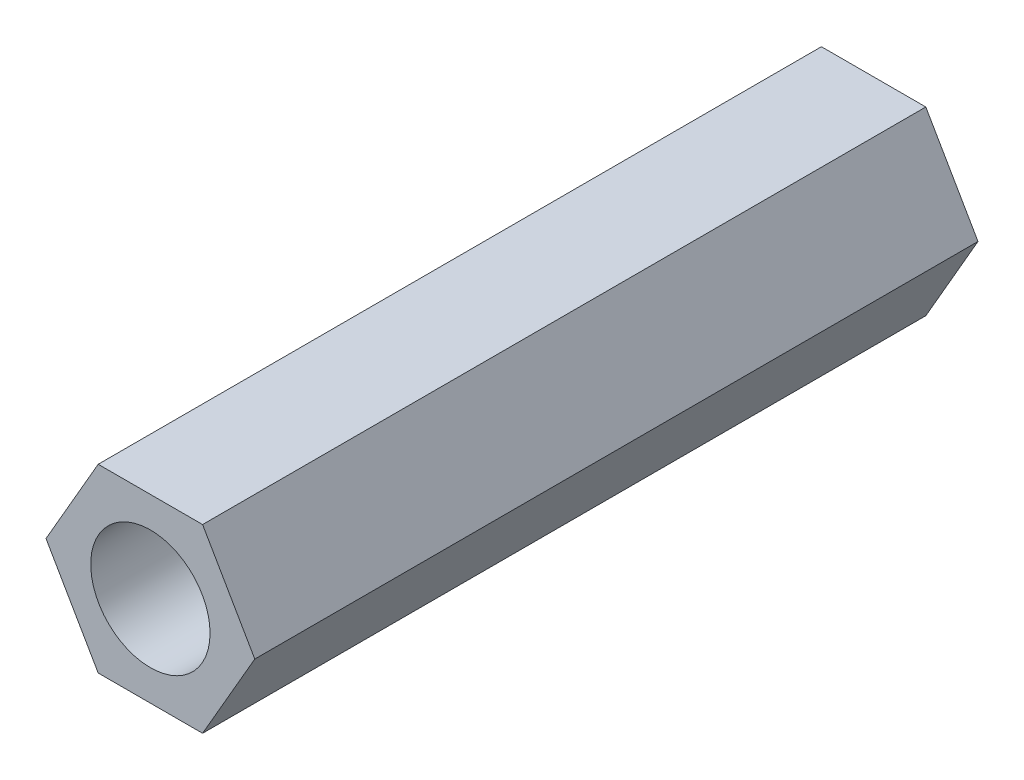
ISO-10303-21;
HEADER;
FILE_DESCRIPTION(('STEP AP214'),'2;1');
FILE_NAME('part.step','',(''),(''),'','','');
FILE_SCHEMA(('AUTOMOTIVE_DESIGN { 1 0 10303 214 1 1 1 1 }'));
ENDSEC;
DATA;
#1=APPLICATION_CONTEXT('core data for automotive mechanical design processes');
#2=APPLICATION_PROTOCOL_DEFINITION('international standard','automotive_design',2000,#1);
#3=PRODUCT_CONTEXT('',#1,'mechanical');
#4=PRODUCT('Part','Part','',(#3));
#5=PRODUCT_RELATED_PRODUCT_CATEGORY('part','',(#4));
#6=PRODUCT_DEFINITION_FORMATION('','',#4);
#7=PRODUCT_DEFINITION_CONTEXT('part definition',#1,'design');
#8=PRODUCT_DEFINITION('design','',#6,#7);
#9=PRODUCT_DEFINITION_SHAPE('','',#8);
#10=(LENGTH_UNIT() NAMED_UNIT(*) SI_UNIT(.MILLI.,.METRE.));
#11=(NAMED_UNIT(*) PLANE_ANGLE_UNIT() SI_UNIT($,.RADIAN.));
#12=(NAMED_UNIT(*) SI_UNIT($,.STERADIAN.) SOLID_ANGLE_UNIT());
#13=UNCERTAINTY_MEASURE_WITH_UNIT(LENGTH_MEASURE(1.E-05),#10,'distance_accuracy_value','');
#14=(GEOMETRIC_REPRESENTATION_CONTEXT(3) GLOBAL_UNCERTAINTY_ASSIGNED_CONTEXT((#13)) GLOBAL_UNIT_ASSIGNED_CONTEXT((#10,
#11,#12)) REPRESENTATION_CONTEXT('',''));
#15=CARTESIAN_POINT('',(0.,0.,0.));
#16=DIRECTION('',(0.,0.,1.));
#17=DIRECTION('',(1.,0.,0.));
#18=AXIS2_PLACEMENT_3D('',#15,#16,#17);
#19=CARTESIAN_POINT('',(0.,0.,20.));
#20=DIRECTION('',(0.,0.,1.));
#21=DIRECTION('',(1.,0.,0.));
#22=AXIS2_PLACEMENT_3D('',#19,#20,#21);
#23=PLANE('',#22);
#24=DIRECTION('',(0.5,0.866025403784439,0.));
#25=VECTOR('',#24,1.);
#26=CARTESIAN_POINT('',(1.44337567297406,-2.5,20.));
#27=LINE('',#26,#25);
#28=CARTESIAN_POINT('',(1.44337567297406,-2.5,20.));
#29=VERTEX_POINT('',#28);
#30=CARTESIAN_POINT('',(2.88675134594813,0.,20.));
#31=VERTEX_POINT('',#30);
#32=EDGE_CURVE('E135',#29,#31,#27,.T.);
#33=ORIENTED_EDGE('',*,*,#32,.T.);
#34=DIRECTION('',(-0.5,0.866025403784439,0.));
#35=VECTOR('',#34,1.);
#36=CARTESIAN_POINT('',(2.88675134594813,0.,20.));
#37=LINE('',#36,#35);
#38=CARTESIAN_POINT('',(1.44337567297406,2.5,20.));
#39=VERTEX_POINT('',#38);
#40=EDGE_CURVE('E93',#31,#39,#37,.T.);
#41=ORIENTED_EDGE('',*,*,#40,.T.);
#42=DIRECTION('',(-1.,0.,0.));
#43=VECTOR('',#42,1.);
#44=CARTESIAN_POINT('',(1.44337567297406,2.5,20.));
#45=LINE('',#44,#43);
#46=CARTESIAN_POINT('',(-1.44337567297406,2.5,20.));
#47=VERTEX_POINT('',#46);
#48=EDGE_CURVE('E106',#39,#47,#45,.T.);
#49=ORIENTED_EDGE('',*,*,#48,.T.);
#50=DIRECTION('',(-0.5,-0.866025403784439,0.));
#51=VECTOR('',#50,1.);
#52=CARTESIAN_POINT('',(-1.44337567297406,2.5,20.));
#53=LINE('',#52,#51);
#54=CARTESIAN_POINT('',(-2.88675134594813,0.,20.));
#55=VERTEX_POINT('',#54);
#56=EDGE_CURVE('E100',#47,#55,#53,.T.);
#57=ORIENTED_EDGE('',*,*,#56,.T.);
#58=DIRECTION('',(0.5,-0.866025403784439,0.));
#59=VECTOR('',#58,1.);
#60=CARTESIAN_POINT('',(-2.88675134594813,0.,20.));
#61=LINE('',#60,#59);
#62=CARTESIAN_POINT('',(-1.44337567297407,-2.5,20.));
#63=VERTEX_POINT('',#62);
#64=EDGE_CURVE('E104',#55,#63,#61,.T.);
#65=ORIENTED_EDGE('',*,*,#64,.T.);
#66=DIRECTION('',(1.,0.,0.));
#67=VECTOR('',#66,1.);
#68=CARTESIAN_POINT('',(-1.44337567297407,-2.5,20.));
#69=LINE('',#68,#67);
#70=EDGE_CURVE('E56',#63,#29,#69,.T.);
#71=ORIENTED_EDGE('',*,*,#70,.T.);
#72=EDGE_LOOP('',(#33,#41,#49,#57,#65,#71));
#73=FACE_BOUND('',#72,.T.);
#74=CARTESIAN_POINT('',(0.,0.,20.));
#75=DIRECTION('',(0.,0.,1.));
#76=DIRECTION('',(1.,0.,0.));
#77=AXIS2_PLACEMENT_3D('',#74,#75,#76);
#78=CIRCLE('',#77,1.65);
#79=CARTESIAN_POINT('',(1.65,0.,20.));
#80=VERTEX_POINT('',#79);
#81=EDGE_CURVE('E128',#80,#80,#78,.T.);
#82=ORIENTED_EDGE('',*,*,#81,.F.);
#83=EDGE_LOOP('',(#82));
#84=FACE_BOUND('',#83,.T.);
#85=ADVANCED_FACE('F39',(#73,#84),#23,.T.);
#86=CARTESIAN_POINT('',(0.,0.,0.));
#87=DIRECTION('',(0.,0.,1.));
#88=DIRECTION('',(1.,0.,0.));
#89=AXIS2_PLACEMENT_3D('',#86,#87,#88);
#90=PLANE('',#89);
#91=DIRECTION('',(0.5,0.866025403784439,0.));
#92=VECTOR('',#91,1.);
#93=CARTESIAN_POINT('',(1.44337567297406,-2.5,0.));
#94=LINE('',#93,#92);
#95=CARTESIAN_POINT('',(1.44337567297406,-2.5,0.));
#96=VERTEX_POINT('',#95);
#97=CARTESIAN_POINT('',(2.88675134594813,0.,0.));
#98=VERTEX_POINT('',#97);
#99=EDGE_CURVE('E124',#96,#98,#94,.T.);
#100=ORIENTED_EDGE('',*,*,#99,.F.);
#101=DIRECTION('',(1.,0.,0.));
#102=VECTOR('',#101,1.);
#103=CARTESIAN_POINT('',(-1.44337567297407,-2.5,0.));
#104=LINE('',#103,#102);
#105=CARTESIAN_POINT('',(-1.44337567297407,-2.5,0.));
#106=VERTEX_POINT('',#105);
#107=EDGE_CURVE('E85',#106,#96,#104,.T.);
#108=ORIENTED_EDGE('',*,*,#107,.F.);
#109=DIRECTION('',(0.5,-0.866025403784439,0.));
#110=VECTOR('',#109,1.);
#111=CARTESIAN_POINT('',(-2.88675134594813,0.,0.));
#112=LINE('',#111,#110);
#113=CARTESIAN_POINT('',(-2.88675134594813,0.,0.));
#114=VERTEX_POINT('',#113);
#115=EDGE_CURVE('E79',#114,#106,#112,.T.);
#116=ORIENTED_EDGE('',*,*,#115,.F.);
#117=DIRECTION('',(-0.5,-0.866025403784439,0.));
#118=VECTOR('',#117,1.);
#119=CARTESIAN_POINT('',(-1.44337567297406,2.5,0.));
#120=LINE('',#119,#118);
#121=CARTESIAN_POINT('',(-1.44337567297406,2.5,0.));
#122=VERTEX_POINT('',#121);
#123=EDGE_CURVE('E114',#122,#114,#120,.T.);
#124=ORIENTED_EDGE('',*,*,#123,.F.);
#125=DIRECTION('',(-1.,0.,0.));
#126=VECTOR('',#125,1.);
#127=CARTESIAN_POINT('',(1.44337567297406,2.5,0.));
#128=LINE('',#127,#126);
#129=CARTESIAN_POINT('',(1.44337567297406,2.5,0.));
#130=VERTEX_POINT('',#129);
#131=EDGE_CURVE('E130',#130,#122,#128,.T.);
#132=ORIENTED_EDGE('',*,*,#131,.F.);
#133=DIRECTION('',(-0.5,0.866025403784439,0.));
#134=VECTOR('',#133,1.);
#135=CARTESIAN_POINT('',(2.88675134594813,0.,0.));
#136=LINE('',#135,#134);
#137=EDGE_CURVE('E127',#98,#130,#136,.T.);
#138=ORIENTED_EDGE('',*,*,#137,.F.);
#139=EDGE_LOOP('',(#100,#108,#116,#124,#132,#138));
#140=FACE_BOUND('',#139,.T.);
#141=CARTESIAN_POINT('',(0.,0.,0.));
#142=DIRECTION('',(0.,0.,1.));
#143=DIRECTION('',(1.,0.,0.));
#144=AXIS2_PLACEMENT_3D('',#141,#142,#143);
#145=CIRCLE('',#144,1.65);
#146=CARTESIAN_POINT('',(1.65,0.,0.));
#147=VERTEX_POINT('',#146);
#148=EDGE_CURVE('E246',#147,#147,#145,.T.);
#149=ORIENTED_EDGE('',*,*,#148,.T.);
#150=EDGE_LOOP('',(#149));
#151=FACE_BOUND('',#150,.T.);
#152=ADVANCED_FACE('F144',(#140,#151),#90,.F.);
#153=CARTESIAN_POINT('',(1.44337567297406,-2.5,20.));
#154=DIRECTION('',(-0.866025403784439,0.5,0.));
#155=DIRECTION('',(-0.5,-0.866025403784439,0.));
#156=AXIS2_PLACEMENT_3D('',#153,#154,#155);
#157=PLANE('',#156);
#158=ORIENTED_EDGE('',*,*,#99,.T.);
#159=DIRECTION('',(0.,0.,-1.));
#160=VECTOR('',#159,1.);
#161=CARTESIAN_POINT('',(2.88675134594813,0.,20.));
#162=LINE('',#161,#160);
#163=EDGE_CURVE('E11',#31,#98,#162,.T.);
#164=ORIENTED_EDGE('',*,*,#163,.F.);
#165=ORIENTED_EDGE('',*,*,#32,.F.);
#166=DIRECTION('',(0.,0.,-1.));
#167=VECTOR('',#166,1.);
#168=CARTESIAN_POINT('',(1.44337567297406,-2.5,20.));
#169=LINE('',#168,#167);
#170=EDGE_CURVE('E120',#29,#96,#169,.T.);
#171=ORIENTED_EDGE('',*,*,#170,.T.);
#172=EDGE_LOOP('',(#158,#164,#165,#171));
#173=FACE_BOUND('',#172,.T.);
#174=ADVANCED_FACE('F41',(#173),#157,.F.);
#175=CARTESIAN_POINT('',(2.88675134594813,0.,20.));
#176=DIRECTION('',(-0.866025403784439,-0.5,0.));
#177=DIRECTION('',(0.5,-0.866025403784439,0.));
#178=AXIS2_PLACEMENT_3D('',#175,#176,#177);
#179=PLANE('',#178);
#180=ORIENTED_EDGE('',*,*,#137,.T.);
#181=DIRECTION('',(0.,0.,-1.));
#182=VECTOR('',#181,1.);
#183=CARTESIAN_POINT('',(1.44337567297406,2.5,20.));
#184=LINE('',#183,#182);
#185=EDGE_CURVE('E48',#39,#130,#184,.T.);
#186=ORIENTED_EDGE('',*,*,#185,.F.);
#187=ORIENTED_EDGE('',*,*,#40,.F.);
#188=ORIENTED_EDGE('',*,*,#163,.T.);
#189=EDGE_LOOP('',(#180,#186,#187,#188));
#190=FACE_BOUND('',#189,.T.);
#191=ADVANCED_FACE('F169',(#190),#179,.F.);
#192=CARTESIAN_POINT('',(1.44337567297406,2.5,20.));
#193=DIRECTION('',(0.,-1.,0.));
#194=DIRECTION('',(1.,0.,0.));
#195=AXIS2_PLACEMENT_3D('',#192,#193,#194);
#196=PLANE('',#195);
#197=ORIENTED_EDGE('',*,*,#131,.T.);
#198=DIRECTION('',(0.,0.,-1.));
#199=VECTOR('',#198,1.);
#200=CARTESIAN_POINT('',(-1.44337567297406,2.5,20.));
#201=LINE('',#200,#199);
#202=EDGE_CURVE('E115',#47,#122,#201,.T.);
#203=ORIENTED_EDGE('',*,*,#202,.F.);
#204=ORIENTED_EDGE('',*,*,#48,.F.);
#205=ORIENTED_EDGE('',*,*,#185,.T.);
#206=EDGE_LOOP('',(#197,#203,#204,#205));
#207=FACE_BOUND('',#206,.T.);
#208=ADVANCED_FACE('F141',(#207),#196,.F.);
#209=CARTESIAN_POINT('',(-1.44337567297406,2.5,20.));
#210=DIRECTION('',(0.866025403784438,-0.5,0.));
#211=DIRECTION('',(0.5,0.866025403784439,0.));
#212=AXIS2_PLACEMENT_3D('',#209,#210,#211);
#213=PLANE('',#212);
#214=ORIENTED_EDGE('',*,*,#123,.T.);
#215=DIRECTION('',(0.,0.,-1.));
#216=VECTOR('',#215,1.);
#217=CARTESIAN_POINT('',(-2.88675134594813,0.,20.));
#218=LINE('',#217,#216);
#219=EDGE_CURVE('E111',#55,#114,#218,.T.);
#220=ORIENTED_EDGE('',*,*,#219,.F.);
#221=ORIENTED_EDGE('',*,*,#56,.F.);
#222=ORIENTED_EDGE('',*,*,#202,.T.);
#223=EDGE_LOOP('',(#214,#220,#221,#222));
#224=FACE_BOUND('',#223,.T.);
#225=ADVANCED_FACE('F112',(#224),#213,.F.);
#226=CARTESIAN_POINT('',(-2.88675134594813,0.,20.));
#227=DIRECTION('',(0.866025403784439,0.5,0.));
#228=DIRECTION('',(-0.5,0.866025403784439,0.));
#229=AXIS2_PLACEMENT_3D('',#226,#227,#228);
#230=PLANE('',#229);
#231=ORIENTED_EDGE('',*,*,#115,.T.);
#232=DIRECTION('',(0.,0.,-1.));
#233=VECTOR('',#232,1.);
#234=CARTESIAN_POINT('',(-1.44337567297407,-2.5,20.));
#235=LINE('',#234,#233);
#236=EDGE_CURVE('E116',#63,#106,#235,.T.);
#237=ORIENTED_EDGE('',*,*,#236,.F.);
#238=ORIENTED_EDGE('',*,*,#64,.F.);
#239=ORIENTED_EDGE('',*,*,#219,.T.);
#240=EDGE_LOOP('',(#231,#237,#238,#239));
#241=FACE_BOUND('',#240,.T.);
#242=ADVANCED_FACE('F118',(#241),#230,.F.);
#243=CARTESIAN_POINT('',(-1.44337567297407,-2.5,20.));
#244=DIRECTION('',(0.,1.,0.));
#245=DIRECTION('',(-1.,0.,0.));
#246=AXIS2_PLACEMENT_3D('',#243,#244,#245);
#247=PLANE('',#246);
#248=ORIENTED_EDGE('',*,*,#107,.T.);
#249=ORIENTED_EDGE('',*,*,#170,.F.);
#250=ORIENTED_EDGE('',*,*,#70,.F.);
#251=ORIENTED_EDGE('',*,*,#236,.T.);
#252=EDGE_LOOP('',(#248,#249,#250,#251));
#253=FACE_BOUND('',#252,.T.);
#254=ADVANCED_FACE('F149',(#253),#247,.F.);
#255=CARTESIAN_POINT('',(0.,0.,20.));
#256=DIRECTION('',(0.,0.,-1.));
#257=DIRECTION('',(-1.,0.,0.));
#258=AXIS2_PLACEMENT_3D('',#255,#256,#257);
#259=CYLINDRICAL_SURFACE('',#258,1.65);
#260=ORIENTED_EDGE('',*,*,#81,.T.);
#261=EDGE_LOOP('',(#260));
#262=FACE_BOUND('',#261,.T.);
#263=ORIENTED_EDGE('',*,*,#148,.F.);
#264=EDGE_LOOP('',(#263));
#265=FACE_BOUND('',#264,.T.);
#266=ADVANCED_FACE('F151',(#262,#265),#259,.F.);
#267=CLOSED_SHELL('',(#85,#152,#174,#191,#208,#225,#242,#254,#266));
#268=MANIFOLD_SOLID_BREP('B2',#267);
#269=ADVANCED_BREP_SHAPE_REPRESENTATION('',(#18,#268),#14);
#270=SHAPE_DEFINITION_REPRESENTATION(#9,#269);
ENDSEC;
END-ISO-10303-21;
